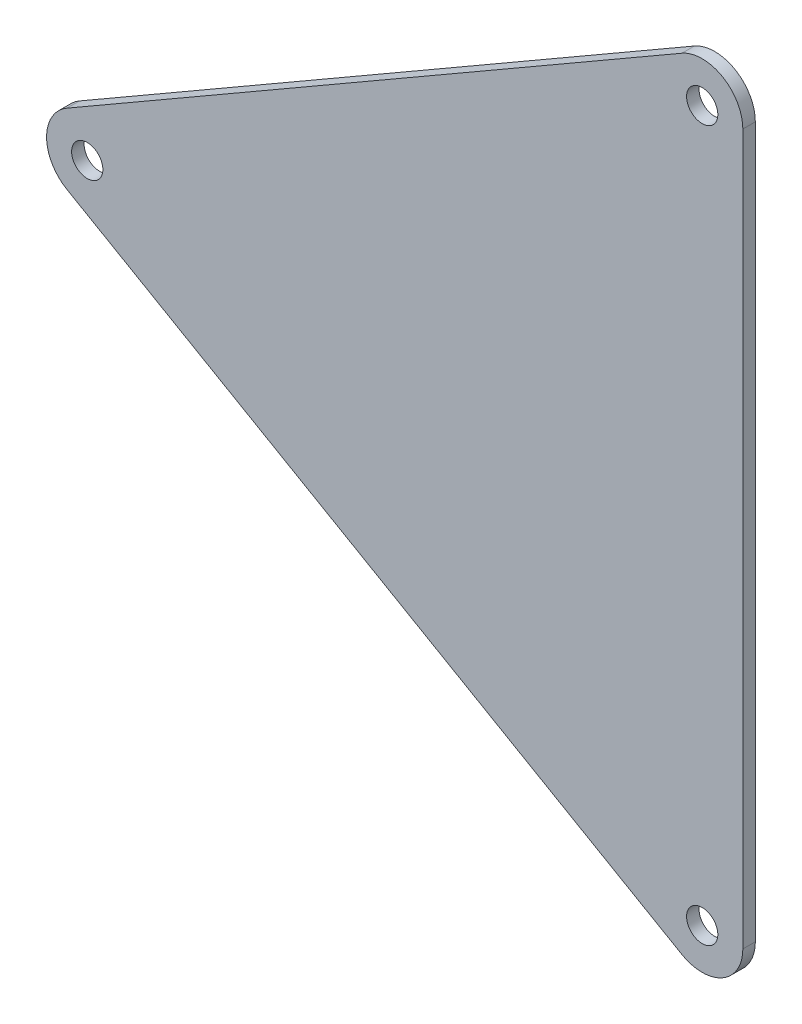
ISO-10303-21;
HEADER;
FILE_DESCRIPTION(('STEP AP214'),'2;1');
FILE_NAME('part.step','',(''),(''),'','','');
FILE_SCHEMA(('AUTOMOTIVE_DESIGN { 1 0 10303 214 1 1 1 1 }'));
ENDSEC;
DATA;
#1=APPLICATION_CONTEXT('core data for automotive mechanical design processes');
#2=APPLICATION_PROTOCOL_DEFINITION('international standard','automotive_design',2000,#1);
#3=PRODUCT_CONTEXT('',#1,'mechanical');
#4=PRODUCT('Part','Part','',(#3));
#5=PRODUCT_RELATED_PRODUCT_CATEGORY('part','',(#4));
#6=PRODUCT_DEFINITION_FORMATION('','',#4);
#7=PRODUCT_DEFINITION_CONTEXT('part definition',#1,'design');
#8=PRODUCT_DEFINITION('design','',#6,#7);
#9=PRODUCT_DEFINITION_SHAPE('','',#8);
#10=(LENGTH_UNIT() NAMED_UNIT(*) SI_UNIT(.MILLI.,.METRE.));
#11=(NAMED_UNIT(*) PLANE_ANGLE_UNIT() SI_UNIT($,.RADIAN.));
#12=(NAMED_UNIT(*) SI_UNIT($,.STERADIAN.) SOLID_ANGLE_UNIT());
#13=UNCERTAINTY_MEASURE_WITH_UNIT(LENGTH_MEASURE(1.E-05),#10,'distance_accuracy_value','');
#14=(GEOMETRIC_REPRESENTATION_CONTEXT(3) GLOBAL_UNCERTAINTY_ASSIGNED_CONTEXT((#13)) GLOBAL_UNIT_ASSIGNED_CONTEXT((#10,
#11,#12)) REPRESENTATION_CONTEXT('',''));
#15=CARTESIAN_POINT('',(0.,0.,0.));
#16=DIRECTION('',(0.,0.,1.));
#17=DIRECTION('',(1.,0.,0.));
#18=AXIS2_PLACEMENT_3D('',#15,#16,#17);
#19=CARTESIAN_POINT('',(346.880404909196,56.7999532573086,2.));
#20=DIRECTION('',(0.,0.,-1.));
#21=DIRECTION('',(-1.,0.,0.));
#22=AXIS2_PLACEMENT_3D('',#19,#20,#21);
#23=CYLINDRICAL_SURFACE('',#22,6.5);
#24=CARTESIAN_POINT('',(346.880404909196,56.7999532573086,0.));
#25=DIRECTION('',(0.,0.,1.));
#26=DIRECTION('',(1.,0.,0.));
#27=AXIS2_PLACEMENT_3D('',#24,#25,#26);
#28=CIRCLE('',#27,6.5);
#29=CARTESIAN_POINT('',(343.630404909196,62.4291183819074,0.));
#30=VERTEX_POINT('',#29);
#31=CARTESIAN_POINT('',(353.380404909196,56.7999532573086,0.));
#32=VERTEX_POINT('',#31);
#33=EDGE_CURVE('E123',#30,#32,#28,.F.);
#34=ORIENTED_EDGE('',*,*,#33,.F.);
#35=DIRECTION('',(0.,0.,-1.));
#36=VECTOR('',#35,1.);
#37=CARTESIAN_POINT('',(343.630404909196,62.4291183819074,2.));
#38=LINE('',#37,#36);
#39=CARTESIAN_POINT('',(343.630404909196,62.4291183819074,2.));
#40=VERTEX_POINT('',#39);
#41=EDGE_CURVE('E11',#40,#30,#38,.T.);
#42=ORIENTED_EDGE('',*,*,#41,.F.);
#43=CARTESIAN_POINT('',(346.880404909196,56.7999532573086,2.));
#44=DIRECTION('',(0.,0.,1.));
#45=DIRECTION('',(1.,0.,0.));
#46=AXIS2_PLACEMENT_3D('',#43,#44,#45);
#47=CIRCLE('',#46,6.5);
#48=CARTESIAN_POINT('',(353.380404909196,56.7999532573086,2.));
#49=VERTEX_POINT('',#48);
#50=EDGE_CURVE('E144',#40,#49,#47,.F.);
#51=ORIENTED_EDGE('',*,*,#50,.T.);
#52=DIRECTION('',(0.,0.,-1.));
#53=VECTOR('',#52,1.);
#54=CARTESIAN_POINT('',(353.380404909196,56.7999532573086,2.));
#55=LINE('',#54,#53);
#56=EDGE_CURVE('E77',#49,#32,#55,.T.);
#57=ORIENTED_EDGE('',*,*,#56,.T.);
#58=EDGE_LOOP('',(#34,#42,#51,#57));
#59=FACE_BOUND('',#58,.T.);
#60=ADVANCED_FACE('F32',(#59),#23,.T.);
#61=CARTESIAN_POINT('',(58.8750000000003,-101.974491295618,2.));
#62=DIRECTION('',(-0.500000000000001,0.866025403784438,0.));
#63=DIRECTION('',(-0.866025403784438,-0.500000000000001,0.));
#64=AXIS2_PLACEMENT_3D('',#61,#62,#63);
#65=PLANE('',#64);
#66=DIRECTION('',(0.866025403784438,0.500000000000001,0.));
#67=VECTOR('',#66,1.);
#68=CARTESIAN_POINT('',(58.8750000000003,-101.974491295618,0.));
#69=LINE('',#68,#67);
#70=CARTESIAN_POINT('',(245.25,5.62916512459882,0.));
#71=VERTEX_POINT('',#70);
#72=EDGE_CURVE('E126',#71,#30,#69,.T.);
#73=ORIENTED_EDGE('',*,*,#72,.F.);
#74=DIRECTION('',(0.,0.,-1.));
#75=VECTOR('',#74,1.);
#76=CARTESIAN_POINT('',(245.25,5.62916512459882,2.));
#77=LINE('',#76,#75);
#78=CARTESIAN_POINT('',(245.25,5.62916512459882,2.));
#79=VERTEX_POINT('',#78);
#80=EDGE_CURVE('E40',#79,#71,#77,.T.);
#81=ORIENTED_EDGE('',*,*,#80,.F.);
#82=DIRECTION('',(0.866025403784438,0.500000000000001,0.));
#83=VECTOR('',#82,1.);
#84=CARTESIAN_POINT('',(58.8750000000003,-101.974491295618,2.));
#85=LINE('',#84,#83);
#86=EDGE_CURVE('E157',#79,#40,#85,.T.);
#87=ORIENTED_EDGE('',*,*,#86,.T.);
#88=ORIENTED_EDGE('',*,*,#41,.T.);
#89=EDGE_LOOP('',(#73,#81,#87,#88));
#90=FACE_BOUND('',#89,.T.);
#91=ADVANCED_FACE('F156',(#90),#65,.T.);
#92=CARTESIAN_POINT('',(248.5,0.,2.));
#93=DIRECTION('',(0.,0.,-1.));
#94=DIRECTION('',(-1.,0.,0.));
#95=AXIS2_PLACEMENT_3D('',#92,#93,#94);
#96=CYLINDRICAL_SURFACE('',#95,6.49999999999993);
#97=CARTESIAN_POINT('',(248.5,0.,0.));
#98=DIRECTION('',(0.,0.,1.));
#99=DIRECTION('',(1.,0.,0.));
#100=AXIS2_PLACEMENT_3D('',#97,#98,#99);
#101=CIRCLE('',#100,6.49999999999993);
#102=CARTESIAN_POINT('',(245.25,-5.62916512459881,0.));
#103=VERTEX_POINT('',#102);
#104=EDGE_CURVE('E129',#71,#103,#101,.T.);
#105=ORIENTED_EDGE('',*,*,#104,.T.);
#106=DIRECTION('',(0.,0.,-1.));
#107=VECTOR('',#106,1.);
#108=CARTESIAN_POINT('',(245.25,-5.62916512459881,2.));
#109=LINE('',#108,#107);
#110=CARTESIAN_POINT('',(245.25,-5.62916512459881,2.));
#111=VERTEX_POINT('',#110);
#112=EDGE_CURVE('E106',#111,#103,#109,.T.);
#113=ORIENTED_EDGE('',*,*,#112,.F.);
#114=CARTESIAN_POINT('',(248.5,0.,2.));
#115=DIRECTION('',(0.,0.,1.));
#116=DIRECTION('',(1.,0.,0.));
#117=AXIS2_PLACEMENT_3D('',#114,#115,#116);
#118=CIRCLE('',#117,6.49999999999993);
#119=EDGE_CURVE('E97',#79,#111,#118,.T.);
#120=ORIENTED_EDGE('',*,*,#119,.F.);
#121=ORIENTED_EDGE('',*,*,#80,.T.);
#122=EDGE_LOOP('',(#105,#113,#120,#121));
#123=FACE_BOUND('',#122,.T.);
#124=ADVANCED_FACE('F149',(#123),#96,.T.);
#125=CARTESIAN_POINT('',(58.8750000000005,101.974491295618,2.));
#126=DIRECTION('',(0.500000000000002,0.866025403784438,0.));
#127=DIRECTION('',(-0.866025403784438,0.500000000000002,0.));
#128=AXIS2_PLACEMENT_3D('',#125,#126,#127);
#129=PLANE('',#128);
#130=DIRECTION('',(0.866025403784438,-0.500000000000002,0.));
#131=VECTOR('',#130,1.);
#132=CARTESIAN_POINT('',(58.8750000000005,101.974491295618,0.));
#133=LINE('',#132,#131);
#134=CARTESIAN_POINT('',(343.630404909196,-62.4291183819075,0.));
#135=VERTEX_POINT('',#134);
#136=EDGE_CURVE('E105',#103,#135,#133,.T.);
#137=ORIENTED_EDGE('',*,*,#136,.T.);
#138=DIRECTION('',(0.,0.,-1.));
#139=VECTOR('',#138,1.);
#140=CARTESIAN_POINT('',(343.630404909196,-62.4291183819075,2.));
#141=LINE('',#140,#139);
#142=CARTESIAN_POINT('',(343.630404909196,-62.4291183819075,2.));
#143=VERTEX_POINT('',#142);
#144=EDGE_CURVE('E102',#143,#135,#141,.T.);
#145=ORIENTED_EDGE('',*,*,#144,.F.);
#146=DIRECTION('',(0.866025403784438,-0.500000000000002,0.));
#147=VECTOR('',#146,1.);
#148=CARTESIAN_POINT('',(58.8750000000005,101.974491295618,2.));
#149=LINE('',#148,#147);
#150=EDGE_CURVE('E89',#111,#143,#149,.T.);
#151=ORIENTED_EDGE('',*,*,#150,.F.);
#152=ORIENTED_EDGE('',*,*,#112,.T.);
#153=EDGE_LOOP('',(#137,#145,#151,#152));
#154=FACE_BOUND('',#153,.T.);
#155=ADVANCED_FACE('F103',(#154),#129,.F.);
#156=CARTESIAN_POINT('',(346.880404909196,-56.7999532573087,2.));
#157=DIRECTION('',(0.,0.,-1.));
#158=DIRECTION('',(-1.,0.,0.));
#159=AXIS2_PLACEMENT_3D('',#156,#157,#158);
#160=CYLINDRICAL_SURFACE('',#159,6.49999999999997);
#161=CARTESIAN_POINT('',(346.880404909196,-56.7999532573087,0.));
#162=DIRECTION('',(0.,0.,1.));
#163=DIRECTION('',(1.,0.,0.));
#164=AXIS2_PLACEMENT_3D('',#161,#162,#163);
#165=CIRCLE('',#164,6.49999999999997);
#166=CARTESIAN_POINT('',(353.380404909196,-56.7999532573086,0.));
#167=VERTEX_POINT('',#166);
#168=EDGE_CURVE('E70',#135,#167,#165,.T.);
#169=ORIENTED_EDGE('',*,*,#168,.T.);
#170=DIRECTION('',(0.,0.,-1.));
#171=VECTOR('',#170,1.);
#172=CARTESIAN_POINT('',(353.380404909196,-56.7999532573086,2.));
#173=LINE('',#172,#171);
#174=CARTESIAN_POINT('',(353.380404909196,-56.7999532573086,2.));
#175=VERTEX_POINT('',#174);
#176=EDGE_CURVE('E107',#175,#167,#173,.T.);
#177=ORIENTED_EDGE('',*,*,#176,.F.);
#178=CARTESIAN_POINT('',(346.880404909196,-56.7999532573087,2.));
#179=DIRECTION('',(0.,0.,1.));
#180=DIRECTION('',(1.,0.,0.));
#181=AXIS2_PLACEMENT_3D('',#178,#179,#180);
#182=CIRCLE('',#181,6.49999999999997);
#183=EDGE_CURVE('E94',#143,#175,#182,.T.);
#184=ORIENTED_EDGE('',*,*,#183,.F.);
#185=ORIENTED_EDGE('',*,*,#144,.T.);
#186=EDGE_LOOP('',(#169,#177,#184,#185));
#187=FACE_BOUND('',#186,.T.);
#188=ADVANCED_FACE('F109',(#187),#160,.T.);
#189=CARTESIAN_POINT('',(346.880404909196,-56.7999532573087,2.));
#190=DIRECTION('',(0.,0.,-1.));
#191=DIRECTION('',(-1.,0.,0.));
#192=AXIS2_PLACEMENT_3D('',#189,#190,#191);
#193=CYLINDRICAL_SURFACE('',#192,2.50000000000003);
#194=CARTESIAN_POINT('',(346.880404909196,-56.7999532573087,2.));
#195=DIRECTION('',(0.,0.,1.));
#196=DIRECTION('',(1.,0.,0.));
#197=AXIS2_PLACEMENT_3D('',#194,#195,#196);
#198=CIRCLE('',#197,2.50000000000003);
#199=CARTESIAN_POINT('',(349.380404909196,-56.7999532573087,2.));
#200=VERTEX_POINT('',#199);
#201=EDGE_CURVE('E117',#200,#200,#198,.T.);
#202=ORIENTED_EDGE('',*,*,#201,.T.);
#203=EDGE_LOOP('',(#202));
#204=FACE_BOUND('',#203,.T.);
#205=CARTESIAN_POINT('',(346.880404909196,-56.7999532573087,0.));
#206=DIRECTION('',(0.,0.,1.));
#207=DIRECTION('',(1.,0.,0.));
#208=AXIS2_PLACEMENT_3D('',#205,#206,#207);
#209=CIRCLE('',#208,2.50000000000003);
#210=CARTESIAN_POINT('',(349.380404909196,-56.7999532573087,0.));
#211=VERTEX_POINT('',#210);
#212=EDGE_CURVE('E138',#211,#211,#209,.T.);
#213=ORIENTED_EDGE('',*,*,#212,.F.);
#214=EDGE_LOOP('',(#213));
#215=FACE_BOUND('',#214,.T.);
#216=ADVANCED_FACE('F173',(#204,#215),#193,.F.);
#217=CARTESIAN_POINT('',(346.880404909196,56.7999532573086,2.));
#218=DIRECTION('',(0.,0.,-1.));
#219=DIRECTION('',(-1.,0.,0.));
#220=AXIS2_PLACEMENT_3D('',#217,#218,#219);
#221=CYLINDRICAL_SURFACE('',#220,2.50000000000002);
#222=CARTESIAN_POINT('',(346.880404909196,56.7999532573086,2.));
#223=DIRECTION('',(0.,0.,1.));
#224=DIRECTION('',(1.,0.,0.));
#225=AXIS2_PLACEMENT_3D('',#222,#223,#224);
#226=CIRCLE('',#225,2.50000000000002);
#227=CARTESIAN_POINT('',(349.380404909196,56.7999532573086,2.));
#228=VERTEX_POINT('',#227);
#229=EDGE_CURVE('E111',#228,#228,#226,.T.);
#230=ORIENTED_EDGE('',*,*,#229,.T.);
#231=EDGE_LOOP('',(#230));
#232=FACE_BOUND('',#231,.T.);
#233=CARTESIAN_POINT('',(346.880404909196,56.7999532573086,0.));
#234=DIRECTION('',(0.,0.,1.));
#235=DIRECTION('',(1.,0.,0.));
#236=AXIS2_PLACEMENT_3D('',#233,#234,#235);
#237=CIRCLE('',#236,2.50000000000002);
#238=CARTESIAN_POINT('',(349.380404909196,56.7999532573086,0.));
#239=VERTEX_POINT('',#238);
#240=EDGE_CURVE('E135',#239,#239,#237,.T.);
#241=ORIENTED_EDGE('',*,*,#240,.F.);
#242=EDGE_LOOP('',(#241));
#243=FACE_BOUND('',#242,.T.);
#244=ADVANCED_FACE('F165',(#232,#243),#221,.F.);
#245=CARTESIAN_POINT('',(353.380404909196,-3.45362134546358E-13,2.));
#246=DIRECTION('',(-1.,0.,0.));
#247=DIRECTION('',(0.,-1.,0.));
#248=AXIS2_PLACEMENT_3D('',#245,#246,#247);
#249=PLANE('',#248);
#250=DIRECTION('',(0.,1.,0.));
#251=VECTOR('',#250,1.);
#252=CARTESIAN_POINT('',(353.380404909196,-3.45362134546358E-13,0.));
#253=LINE('',#252,#251);
#254=EDGE_CURVE('E133',#167,#32,#253,.T.);
#255=ORIENTED_EDGE('',*,*,#254,.T.);
#256=ORIENTED_EDGE('',*,*,#56,.F.);
#257=DIRECTION('',(0.,1.,0.));
#258=VECTOR('',#257,1.);
#259=CARTESIAN_POINT('',(353.380404909196,-3.45362134546358E-13,2.));
#260=LINE('',#259,#258);
#261=EDGE_CURVE('E48',#175,#49,#260,.T.);
#262=ORIENTED_EDGE('',*,*,#261,.F.);
#263=ORIENTED_EDGE('',*,*,#176,.T.);
#264=EDGE_LOOP('',(#255,#256,#262,#263));
#265=FACE_BOUND('',#264,.T.);
#266=ADVANCED_FACE('F160',(#265),#249,.F.);
#267=CARTESIAN_POINT('',(248.5,0.,2.));
#268=DIRECTION('',(0.,0.,-1.));
#269=DIRECTION('',(-1.,0.,0.));
#270=AXIS2_PLACEMENT_3D('',#267,#268,#269);
#271=CYLINDRICAL_SURFACE('',#270,2.50000000000002);
#272=CARTESIAN_POINT('',(248.5,0.,2.));
#273=DIRECTION('',(0.,0.,1.));
#274=DIRECTION('',(1.,0.,0.));
#275=AXIS2_PLACEMENT_3D('',#272,#273,#274);
#276=CIRCLE('',#275,2.50000000000002);
#277=CARTESIAN_POINT('',(251.,0.,2.));
#278=VERTEX_POINT('',#277);
#279=EDGE_CURVE('E120',#278,#278,#276,.T.);
#280=ORIENTED_EDGE('',*,*,#279,.T.);
#281=EDGE_LOOP('',(#280));
#282=FACE_BOUND('',#281,.T.);
#283=CARTESIAN_POINT('',(248.5,0.,0.));
#284=DIRECTION('',(0.,0.,1.));
#285=DIRECTION('',(1.,0.,0.));
#286=AXIS2_PLACEMENT_3D('',#283,#284,#285);
#287=CIRCLE('',#286,2.50000000000002);
#288=CARTESIAN_POINT('',(251.,0.,0.));
#289=VERTEX_POINT('',#288);
#290=EDGE_CURVE('E141',#289,#289,#287,.T.);
#291=ORIENTED_EDGE('',*,*,#290,.F.);
#292=EDGE_LOOP('',(#291));
#293=FACE_BOUND('',#292,.T.);
#294=ADVANCED_FACE('F164',(#282,#293),#271,.F.);
#295=CARTESIAN_POINT('',(0.,0.,2.));
#296=DIRECTION('',(0.,0.,1.));
#297=DIRECTION('',(1.,0.,0.));
#298=AXIS2_PLACEMENT_3D('',#295,#296,#297);
#299=PLANE('',#298);
#300=ORIENTED_EDGE('',*,*,#50,.F.);
#301=ORIENTED_EDGE('',*,*,#86,.F.);
#302=ORIENTED_EDGE('',*,*,#119,.T.);
#303=ORIENTED_EDGE('',*,*,#150,.T.);
#304=ORIENTED_EDGE('',*,*,#183,.T.);
#305=ORIENTED_EDGE('',*,*,#261,.T.);
#306=EDGE_LOOP('',(#300,#301,#302,#303,#304,#305));
#307=FACE_BOUND('',#306,.T.);
#308=ORIENTED_EDGE('',*,*,#229,.F.);
#309=EDGE_LOOP('',(#308));
#310=FACE_BOUND('',#309,.T.);
#311=ORIENTED_EDGE('',*,*,#201,.F.);
#312=EDGE_LOOP('',(#311));
#313=FACE_BOUND('',#312,.T.);
#314=ORIENTED_EDGE('',*,*,#279,.F.);
#315=EDGE_LOOP('',(#314));
#316=FACE_BOUND('',#315,.T.);
#317=ADVANCED_FACE('F91',(#307,#310,#313,#316),#299,.T.);
#318=CARTESIAN_POINT('',(0.,0.,0.));
#319=DIRECTION('',(0.,0.,1.));
#320=DIRECTION('',(1.,0.,0.));
#321=AXIS2_PLACEMENT_3D('',#318,#319,#320);
#322=PLANE('',#321);
#323=ORIENTED_EDGE('',*,*,#33,.T.);
#324=ORIENTED_EDGE('',*,*,#254,.F.);
#325=ORIENTED_EDGE('',*,*,#168,.F.);
#326=ORIENTED_EDGE('',*,*,#136,.F.);
#327=ORIENTED_EDGE('',*,*,#104,.F.);
#328=ORIENTED_EDGE('',*,*,#72,.T.);
#329=EDGE_LOOP('',(#323,#324,#325,#326,#327,#328));
#330=FACE_BOUND('',#329,.T.);
#331=ORIENTED_EDGE('',*,*,#240,.T.);
#332=EDGE_LOOP('',(#331));
#333=FACE_BOUND('',#332,.T.);
#334=ORIENTED_EDGE('',*,*,#212,.T.);
#335=EDGE_LOOP('',(#334));
#336=FACE_BOUND('',#335,.T.);
#337=ORIENTED_EDGE('',*,*,#290,.T.);
#338=EDGE_LOOP('',(#337));
#339=FACE_BOUND('',#338,.T.);
#340=ADVANCED_FACE('F154',(#330,#333,#336,#339),#322,.F.);
#341=CLOSED_SHELL('',(#60,#91,#124,#155,#188,#216,#244,#266,#294,#317,#340));
#342=MANIFOLD_SOLID_BREP('B2',#341);
#343=ADVANCED_BREP_SHAPE_REPRESENTATION('',(#18,#342),#14);
#344=SHAPE_DEFINITION_REPRESENTATION(#9,#343);
ENDSEC;
END-ISO-10303-21;
